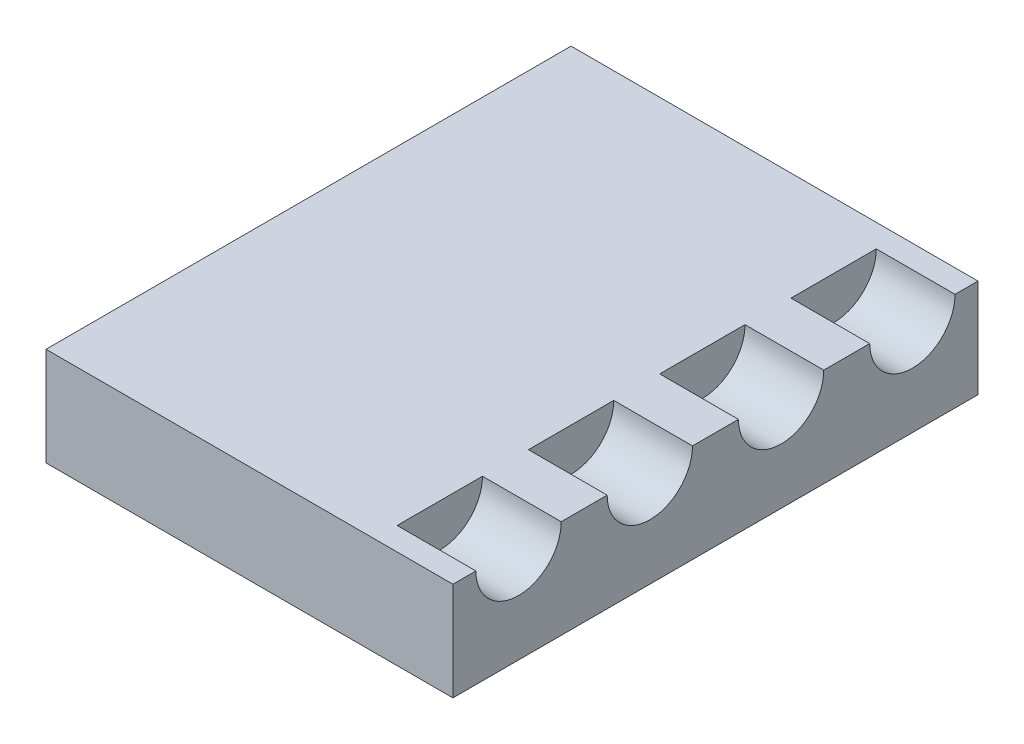
ISO-10303-21;
HEADER;
FILE_DESCRIPTION(('STEP AP214'),'2;1');
FILE_NAME('part.step','',(''),(''),'','','');
FILE_SCHEMA(('AUTOMOTIVE_DESIGN { 1 0 10303 214 1 1 1 1 }'));
ENDSEC;
DATA;
#1=APPLICATION_CONTEXT('core data for automotive mechanical design processes');
#2=APPLICATION_PROTOCOL_DEFINITION('international standard','automotive_design',2000,#1);
#3=PRODUCT_CONTEXT('',#1,'mechanical');
#4=PRODUCT('Part','Part','',(#3));
#5=PRODUCT_RELATED_PRODUCT_CATEGORY('part','',(#4));
#6=PRODUCT_DEFINITION_FORMATION('','',#4);
#7=PRODUCT_DEFINITION_CONTEXT('part definition',#1,'design');
#8=PRODUCT_DEFINITION('design','',#6,#7);
#9=PRODUCT_DEFINITION_SHAPE('','',#8);
#10=(LENGTH_UNIT() NAMED_UNIT(*) SI_UNIT(.MILLI.,.METRE.));
#11=(NAMED_UNIT(*) PLANE_ANGLE_UNIT() SI_UNIT($,.RADIAN.));
#12=(NAMED_UNIT(*) SI_UNIT($,.STERADIAN.) SOLID_ANGLE_UNIT());
#13=UNCERTAINTY_MEASURE_WITH_UNIT(LENGTH_MEASURE(1.E-05),#10,'distance_accuracy_value','');
#14=(GEOMETRIC_REPRESENTATION_CONTEXT(3) GLOBAL_UNCERTAINTY_ASSIGNED_CONTEXT((#13)) GLOBAL_UNIT_ASSIGNED_CONTEXT((#10,
#11,#12)) REPRESENTATION_CONTEXT('',''));
#15=CARTESIAN_POINT('',(0.,0.,0.));
#16=DIRECTION('',(0.,0.,1.));
#17=DIRECTION('',(1.,0.,0.));
#18=AXIS2_PLACEMENT_3D('',#15,#16,#17);
#19=CARTESIAN_POINT('',(12.,0.,-30.));
#20=DIRECTION('',(-1.,0.,0.));
#21=DIRECTION('',(0.,0.,1.));
#22=AXIS2_PLACEMENT_3D('',#19,#20,#21);
#23=CYLINDRICAL_SURFACE('',#22,6.5);
#24=CARTESIAN_POINT('',(0.,0.,-30.));
#25=DIRECTION('',(1.,0.,0.));
#26=DIRECTION('',(0.,0.,-1.));
#27=AXIS2_PLACEMENT_3D('',#24,#25,#26);
#28=CIRCLE('',#27,6.5);
#29=CARTESIAN_POINT('',(0.,0.,-23.5));
#30=VERTEX_POINT('',#29);
#31=CARTESIAN_POINT('',(0.,0.,-36.5));
#32=VERTEX_POINT('',#31);
#33=EDGE_CURVE('E148',#30,#32,#28,.T.);
#34=ORIENTED_EDGE('',*,*,#33,.F.);
#35=DIRECTION('',(-1.,0.,0.));
#36=VECTOR('',#35,1.);
#37=CARTESIAN_POINT('',(12.,0.,-23.5));
#38=LINE('',#37,#36);
#39=CARTESIAN_POINT('',(12.,0.,-23.5));
#40=VERTEX_POINT('',#39);
#41=EDGE_CURVE('E11',#40,#30,#38,.T.);
#42=ORIENTED_EDGE('',*,*,#41,.F.);
#43=CARTESIAN_POINT('',(12.,0.,-30.));
#44=DIRECTION('',(1.,0.,0.));
#45=DIRECTION('',(0.,0.,-1.));
#46=AXIS2_PLACEMENT_3D('',#43,#44,#45);
#47=CIRCLE('',#46,6.5);
#48=CARTESIAN_POINT('',(12.,0.,-36.5));
#49=VERTEX_POINT('',#48);
#50=EDGE_CURVE('E160',#40,#49,#47,.T.);
#51=ORIENTED_EDGE('',*,*,#50,.T.);
#52=DIRECTION('',(-1.,0.,0.));
#53=VECTOR('',#52,1.);
#54=CARTESIAN_POINT('',(12.,0.,-36.5));
#55=LINE('',#54,#53);
#56=EDGE_CURVE('E49',#49,#32,#55,.T.);
#57=ORIENTED_EDGE('',*,*,#56,.T.);
#58=EDGE_LOOP('',(#34,#42,#51,#57));
#59=FACE_BOUND('',#58,.T.);
#60=ADVANCED_FACE('F33',(#59),#23,.F.);
#61=CARTESIAN_POINT('',(12.,0.,-10.));
#62=DIRECTION('',(-1.,0.,0.));
#63=DIRECTION('',(0.,0.,1.));
#64=AXIS2_PLACEMENT_3D('',#61,#62,#63);
#65=CYLINDRICAL_SURFACE('',#64,6.50000000000001);
#66=CARTESIAN_POINT('',(0.,0.,-10.));
#67=DIRECTION('',(1.,0.,0.));
#68=DIRECTION('',(0.,0.,-1.));
#69=AXIS2_PLACEMENT_3D('',#66,#67,#68);
#70=CIRCLE('',#69,6.50000000000001);
#71=CARTESIAN_POINT('',(0.,0.,-3.49999999999999));
#72=VERTEX_POINT('',#71);
#73=CARTESIAN_POINT('',(0.,0.,-16.5));
#74=VERTEX_POINT('',#73);
#75=EDGE_CURVE('E150',#72,#74,#70,.T.);
#76=ORIENTED_EDGE('',*,*,#75,.F.);
#77=DIRECTION('',(-1.,0.,0.));
#78=VECTOR('',#77,1.);
#79=CARTESIAN_POINT('',(12.,0.,-3.49999999999999));
#80=LINE('',#79,#78);
#81=CARTESIAN_POINT('',(12.,0.,-3.49999999999999));
#82=VERTEX_POINT('',#81);
#83=EDGE_CURVE('E174',#82,#72,#80,.T.);
#84=ORIENTED_EDGE('',*,*,#83,.F.);
#85=CARTESIAN_POINT('',(12.,0.,-10.));
#86=DIRECTION('',(1.,0.,0.));
#87=DIRECTION('',(0.,0.,-1.));
#88=AXIS2_PLACEMENT_3D('',#85,#86,#87);
#89=CIRCLE('',#88,6.50000000000001);
#90=CARTESIAN_POINT('',(12.,0.,-16.5));
#91=VERTEX_POINT('',#90);
#92=EDGE_CURVE('E182',#82,#91,#89,.T.);
#93=ORIENTED_EDGE('',*,*,#92,.T.);
#94=DIRECTION('',(-1.,0.,0.));
#95=VECTOR('',#94,1.);
#96=CARTESIAN_POINT('',(12.,0.,-16.5));
#97=LINE('',#96,#95);
#98=EDGE_CURVE('E41',#91,#74,#97,.T.);
#99=ORIENTED_EDGE('',*,*,#98,.T.);
#100=EDGE_LOOP('',(#76,#84,#93,#99));
#101=FACE_BOUND('',#100,.T.);
#102=ADVANCED_FACE('F179',(#101),#65,.F.);
#103=CARTESIAN_POINT('',(12.,0.,10.));
#104=DIRECTION('',(-1.,0.,0.));
#105=DIRECTION('',(0.,0.,1.));
#106=AXIS2_PLACEMENT_3D('',#103,#104,#105);
#107=CYLINDRICAL_SURFACE('',#106,6.5);
#108=CARTESIAN_POINT('',(0.,0.,10.));
#109=DIRECTION('',(1.,0.,0.));
#110=DIRECTION('',(0.,0.,-1.));
#111=AXIS2_PLACEMENT_3D('',#108,#109,#110);
#112=CIRCLE('',#111,6.5);
#113=CARTESIAN_POINT('',(0.,0.,16.5));
#114=VERTEX_POINT('',#113);
#115=CARTESIAN_POINT('',(0.,0.,3.5));
#116=VERTEX_POINT('',#115);
#117=EDGE_CURVE('E154',#114,#116,#112,.T.);
#118=ORIENTED_EDGE('',*,*,#117,.F.);
#119=DIRECTION('',(-1.,0.,0.));
#120=VECTOR('',#119,1.);
#121=CARTESIAN_POINT('',(12.,0.,16.5));
#122=LINE('',#121,#120);
#123=CARTESIAN_POINT('',(12.,0.,16.5));
#124=VERTEX_POINT('',#123);
#125=EDGE_CURVE('E170',#124,#114,#122,.T.);
#126=ORIENTED_EDGE('',*,*,#125,.F.);
#127=CARTESIAN_POINT('',(12.,0.,10.));
#128=DIRECTION('',(1.,0.,0.));
#129=DIRECTION('',(0.,0.,-1.));
#130=AXIS2_PLACEMENT_3D('',#127,#128,#129);
#131=CIRCLE('',#130,6.5);
#132=CARTESIAN_POINT('',(12.,0.,3.5));
#133=VERTEX_POINT('',#132);
#134=EDGE_CURVE('E203',#124,#133,#131,.T.);
#135=ORIENTED_EDGE('',*,*,#134,.T.);
#136=DIRECTION('',(-1.,0.,0.));
#137=VECTOR('',#136,1.);
#138=CARTESIAN_POINT('',(12.,0.,3.5));
#139=LINE('',#138,#137);
#140=EDGE_CURVE('E172',#133,#116,#139,.T.);
#141=ORIENTED_EDGE('',*,*,#140,.T.);
#142=EDGE_LOOP('',(#118,#126,#135,#141));
#143=FACE_BOUND('',#142,.T.);
#144=ADVANCED_FACE('F215',(#143),#107,.F.);
#145=CARTESIAN_POINT('',(12.,0.,30.));
#146=DIRECTION('',(-1.,0.,0.));
#147=DIRECTION('',(0.,0.,1.));
#148=AXIS2_PLACEMENT_3D('',#145,#146,#147);
#149=CYLINDRICAL_SURFACE('',#148,6.5);
#150=CARTESIAN_POINT('',(0.,0.,30.));
#151=DIRECTION('',(1.,0.,0.));
#152=DIRECTION('',(0.,0.,-1.));
#153=AXIS2_PLACEMENT_3D('',#150,#151,#152);
#154=CIRCLE('',#153,6.5);
#155=CARTESIAN_POINT('',(0.,0.,36.5));
#156=VERTEX_POINT('',#155);
#157=CARTESIAN_POINT('',(0.,0.,23.5));
#158=VERTEX_POINT('',#157);
#159=EDGE_CURVE('E157',#156,#158,#154,.T.);
#160=ORIENTED_EDGE('',*,*,#159,.F.);
#161=DIRECTION('',(-1.,0.,0.));
#162=VECTOR('',#161,1.);
#163=CARTESIAN_POINT('',(12.,0.,36.5));
#164=LINE('',#163,#162);
#165=CARTESIAN_POINT('',(12.,0.,36.5));
#166=VERTEX_POINT('',#165);
#167=EDGE_CURVE('E75',#166,#156,#164,.T.);
#168=ORIENTED_EDGE('',*,*,#167,.F.);
#169=CARTESIAN_POINT('',(12.,0.,30.));
#170=DIRECTION('',(1.,0.,0.));
#171=DIRECTION('',(0.,0.,-1.));
#172=AXIS2_PLACEMENT_3D('',#169,#170,#171);
#173=CIRCLE('',#172,6.5);
#174=CARTESIAN_POINT('',(12.,0.,23.5));
#175=VERTEX_POINT('',#174);
#176=EDGE_CURVE('E207',#166,#175,#173,.T.);
#177=ORIENTED_EDGE('',*,*,#176,.T.);
#178=DIRECTION('',(-1.,0.,0.));
#179=VECTOR('',#178,1.);
#180=CARTESIAN_POINT('',(12.,0.,23.5));
#181=LINE('',#180,#179);
#182=EDGE_CURVE('E168',#175,#158,#181,.T.);
#183=ORIENTED_EDGE('',*,*,#182,.T.);
#184=EDGE_LOOP('',(#160,#168,#177,#183));
#185=FACE_BOUND('',#184,.T.);
#186=ADVANCED_FACE('F249',(#185),#149,.F.);
#187=CARTESIAN_POINT('',(12.,0.,40.));
#188=DIRECTION('',(0.,0.,-1.));
#189=DIRECTION('',(-1.,0.,0.));
#190=AXIS2_PLACEMENT_3D('',#187,#188,#189);
#191=PLANE('',#190);
#192=DIRECTION('',(-1.,0.,0.));
#193=VECTOR('',#192,1.);
#194=CARTESIAN_POINT('',(12.,0.,40.));
#195=LINE('',#194,#193);
#196=CARTESIAN_POINT('',(12.,0.,40.));
#197=VERTEX_POINT('',#196);
#198=CARTESIAN_POINT('',(-50.,0.,40.));
#199=VERTEX_POINT('',#198);
#200=EDGE_CURVE('E164',#197,#199,#195,.T.);
#201=ORIENTED_EDGE('',*,*,#200,.T.);
#202=DIRECTION('',(0.,1.,0.));
#203=VECTOR('',#202,1.);
#204=CARTESIAN_POINT('',(-50.,-15.,40.));
#205=LINE('',#204,#203);
#206=CARTESIAN_POINT('',(-50.,-15.,40.));
#207=VERTEX_POINT('',#206);
#208=EDGE_CURVE('E244',#207,#199,#205,.T.);
#209=ORIENTED_EDGE('',*,*,#208,.F.);
#210=DIRECTION('',(-1.,0.,0.));
#211=VECTOR('',#210,1.);
#212=CARTESIAN_POINT('',(12.,-15.,40.));
#213=LINE('',#212,#211);
#214=CARTESIAN_POINT('',(12.,-15.,40.));
#215=VERTEX_POINT('',#214);
#216=EDGE_CURVE('E136',#215,#207,#213,.T.);
#217=ORIENTED_EDGE('',*,*,#216,.F.);
#218=DIRECTION('',(0.,-1.,0.));
#219=VECTOR('',#218,1.);
#220=CARTESIAN_POINT('',(12.,0.,40.));
#221=LINE('',#220,#219);
#222=EDGE_CURVE('E121',#197,#215,#221,.T.);
#223=ORIENTED_EDGE('',*,*,#222,.F.);
#224=EDGE_LOOP('',(#201,#209,#217,#223));
#225=FACE_BOUND('',#224,.T.);
#226=ADVANCED_FACE('F252',(#225),#191,.F.);
#227=CARTESIAN_POINT('',(12.,-15.,0.));
#228=DIRECTION('',(0.,1.,0.));
#229=DIRECTION('',(0.,0.,1.));
#230=AXIS2_PLACEMENT_3D('',#227,#228,#229);
#231=PLANE('',#230);
#232=ORIENTED_EDGE('',*,*,#216,.T.);
#233=DIRECTION('',(0.,0.,1.));
#234=VECTOR('',#233,1.);
#235=CARTESIAN_POINT('',(-50.,-15.,-40.));
#236=LINE('',#235,#234);
#237=CARTESIAN_POINT('',(-50.,-15.,-40.));
#238=VERTEX_POINT('',#237);
#239=EDGE_CURVE('E132',#238,#207,#236,.T.);
#240=ORIENTED_EDGE('',*,*,#239,.F.);
#241=DIRECTION('',(-1.,0.,0.));
#242=VECTOR('',#241,1.);
#243=CARTESIAN_POINT('',(12.,-15.,-40.));
#244=LINE('',#243,#242);
#245=CARTESIAN_POINT('',(12.,-15.,-40.));
#246=VERTEX_POINT('',#245);
#247=EDGE_CURVE('E128',#246,#238,#244,.T.);
#248=ORIENTED_EDGE('',*,*,#247,.F.);
#249=DIRECTION('',(0.,0.,-1.));
#250=VECTOR('',#249,1.);
#251=CARTESIAN_POINT('',(12.,-15.,0.));
#252=LINE('',#251,#250);
#253=EDGE_CURVE('E113',#215,#246,#252,.T.);
#254=ORIENTED_EDGE('',*,*,#253,.F.);
#255=EDGE_LOOP('',(#232,#240,#248,#254));
#256=FACE_BOUND('',#255,.T.);
#257=ADVANCED_FACE('F129',(#256),#231,.F.);
#258=CARTESIAN_POINT('',(12.,0.,-40.));
#259=DIRECTION('',(0.,0.,-1.));
#260=DIRECTION('',(-1.,0.,0.));
#261=AXIS2_PLACEMENT_3D('',#258,#259,#260);
#262=PLANE('',#261);
#263=ORIENTED_EDGE('',*,*,#247,.T.);
#264=DIRECTION('',(0.,-1.,0.));
#265=VECTOR('',#264,1.);
#266=CARTESIAN_POINT('',(-50.,-15.,-40.));
#267=LINE('',#266,#265);
#268=CARTESIAN_POINT('',(-50.,0.,-40.));
#269=VERTEX_POINT('',#268);
#270=EDGE_CURVE('E242',#269,#238,#267,.T.);
#271=ORIENTED_EDGE('',*,*,#270,.F.);
#272=DIRECTION('',(-1.,0.,0.));
#273=VECTOR('',#272,1.);
#274=CARTESIAN_POINT('',(12.,0.,-40.));
#275=LINE('',#274,#273);
#276=CARTESIAN_POINT('',(12.,0.,-40.));
#277=VERTEX_POINT('',#276);
#278=EDGE_CURVE('E137',#277,#269,#275,.T.);
#279=ORIENTED_EDGE('',*,*,#278,.F.);
#280=DIRECTION('',(0.,-1.,0.));
#281=VECTOR('',#280,1.);
#282=CARTESIAN_POINT('',(12.,0.,-40.));
#283=LINE('',#282,#281);
#284=EDGE_CURVE('E118',#277,#246,#283,.T.);
#285=ORIENTED_EDGE('',*,*,#284,.T.);
#286=EDGE_LOOP('',(#263,#271,#279,#285));
#287=FACE_BOUND('',#286,.T.);
#288=ADVANCED_FACE('F139',(#287),#262,.T.);
#289=CARTESIAN_POINT('',(12.,0.,0.));
#290=DIRECTION('',(0.,1.,0.));
#291=DIRECTION('',(0.,0.,1.));
#292=AXIS2_PLACEMENT_3D('',#289,#290,#291);
#293=PLANE('',#292);
#294=ORIENTED_EDGE('',*,*,#278,.T.);
#295=DIRECTION('',(0.,0.,-1.));
#296=VECTOR('',#295,1.);
#297=CARTESIAN_POINT('',(-50.,0.,-40.));
#298=LINE('',#297,#296);
#299=EDGE_CURVE('E151',#199,#269,#298,.T.);
#300=ORIENTED_EDGE('',*,*,#299,.F.);
#301=ORIENTED_EDGE('',*,*,#200,.F.);
#302=DIRECTION('',(0.,0.,-1.));
#303=VECTOR('',#302,1.);
#304=CARTESIAN_POINT('',(12.,0.,0.));
#305=LINE('',#304,#303);
#306=EDGE_CURVE('E144',#197,#166,#305,.T.);
#307=ORIENTED_EDGE('',*,*,#306,.T.);
#308=ORIENTED_EDGE('',*,*,#167,.T.);
#309=DIRECTION('',(0.,0.,-1.));
#310=VECTOR('',#309,1.);
#311=CARTESIAN_POINT('',(0.,0.,-40.));
#312=LINE('',#311,#310);
#313=EDGE_CURVE('E196',#156,#158,#312,.T.);
#314=ORIENTED_EDGE('',*,*,#313,.T.);
#315=ORIENTED_EDGE('',*,*,#182,.F.);
#316=EDGE_CURVE('E206',#175,#124,#305,.T.);
#317=ORIENTED_EDGE('',*,*,#316,.T.);
#318=ORIENTED_EDGE('',*,*,#125,.T.);
#319=EDGE_CURVE('E192',#114,#116,#312,.T.);
#320=ORIENTED_EDGE('',*,*,#319,.T.);
#321=ORIENTED_EDGE('',*,*,#140,.F.);
#322=EDGE_CURVE('E201',#133,#82,#305,.T.);
#323=ORIENTED_EDGE('',*,*,#322,.T.);
#324=ORIENTED_EDGE('',*,*,#83,.T.);
#325=EDGE_CURVE('E189',#72,#74,#312,.T.);
#326=ORIENTED_EDGE('',*,*,#325,.T.);
#327=ORIENTED_EDGE('',*,*,#98,.F.);
#328=EDGE_CURVE('E145',#91,#40,#305,.T.);
#329=ORIENTED_EDGE('',*,*,#328,.T.);
#330=ORIENTED_EDGE('',*,*,#41,.T.);
#331=EDGE_CURVE('E193',#30,#32,#312,.T.);
#332=ORIENTED_EDGE('',*,*,#331,.T.);
#333=ORIENTED_EDGE('',*,*,#56,.F.);
#334=EDGE_CURVE('E141',#49,#277,#305,.T.);
#335=ORIENTED_EDGE('',*,*,#334,.T.);
#336=EDGE_LOOP('',(#294,#300,#301,#307,#308,#314,#315,#317,#318,#320,#321,#323,#324,#326,#327,
#329,#330,#332,#333,#335));
#337=FACE_BOUND('',#336,.T.);
#338=ADVANCED_FACE('F190',(#337),#293,.T.);
#339=CARTESIAN_POINT('',(12.,0.,0.));
#340=DIRECTION('',(1.,0.,0.));
#341=DIRECTION('',(0.,0.,-1.));
#342=AXIS2_PLACEMENT_3D('',#339,#340,#341);
#343=PLANE('',#342);
#344=ORIENTED_EDGE('',*,*,#50,.F.);
#345=ORIENTED_EDGE('',*,*,#328,.F.);
#346=ORIENTED_EDGE('',*,*,#92,.F.);
#347=ORIENTED_EDGE('',*,*,#322,.F.);
#348=ORIENTED_EDGE('',*,*,#134,.F.);
#349=ORIENTED_EDGE('',*,*,#316,.F.);
#350=ORIENTED_EDGE('',*,*,#176,.F.);
#351=ORIENTED_EDGE('',*,*,#306,.F.);
#352=ORIENTED_EDGE('',*,*,#222,.T.);
#353=ORIENTED_EDGE('',*,*,#253,.T.);
#354=ORIENTED_EDGE('',*,*,#284,.F.);
#355=ORIENTED_EDGE('',*,*,#334,.F.);
#356=EDGE_LOOP('',(#344,#345,#346,#347,#348,#349,#350,#351,#352,#353,#354,#355));
#357=FACE_BOUND('',#356,.T.);
#358=ADVANCED_FACE('F115',(#357),#343,.T.);
#359=CARTESIAN_POINT('',(0.,0.,0.));
#360=DIRECTION('',(1.,0.,0.));
#361=DIRECTION('',(0.,0.,-1.));
#362=AXIS2_PLACEMENT_3D('',#359,#360,#361);
#363=PLANE('',#362);
#364=ORIENTED_EDGE('',*,*,#331,.F.);
#365=ORIENTED_EDGE('',*,*,#33,.T.);
#366=EDGE_LOOP('',(#364,#365));
#367=FACE_BOUND('',#366,.T.);
#368=ADVANCED_FACE('F227',(#367),#363,.T.);
#369=ORIENTED_EDGE('',*,*,#313,.F.);
#370=ORIENTED_EDGE('',*,*,#159,.T.);
#371=EDGE_LOOP('',(#369,#370));
#372=FACE_BOUND('',#371,.T.);
#373=ADVANCED_FACE('F220',(#372),#363,.T.);
#374=ORIENTED_EDGE('',*,*,#319,.F.);
#375=ORIENTED_EDGE('',*,*,#117,.T.);
#376=EDGE_LOOP('',(#374,#375));
#377=FACE_BOUND('',#376,.T.);
#378=ADVANCED_FACE('F218',(#377),#363,.T.);
#379=ORIENTED_EDGE('',*,*,#325,.F.);
#380=ORIENTED_EDGE('',*,*,#75,.T.);
#381=EDGE_LOOP('',(#379,#380));
#382=FACE_BOUND('',#381,.T.);
#383=ADVANCED_FACE('F188',(#382),#363,.T.);
#384=CARTESIAN_POINT('',(-50.,0.,0.));
#385=DIRECTION('',(1.,0.,0.));
#386=DIRECTION('',(0.,0.,-1.));
#387=AXIS2_PLACEMENT_3D('',#384,#385,#386);
#388=PLANE('',#387);
#389=ORIENTED_EDGE('',*,*,#270,.T.);
#390=ORIENTED_EDGE('',*,*,#239,.T.);
#391=ORIENTED_EDGE('',*,*,#208,.T.);
#392=ORIENTED_EDGE('',*,*,#299,.T.);
#393=EDGE_LOOP('',(#389,#390,#391,#392));
#394=FACE_BOUND('',#393,.T.);
#395=ADVANCED_FACE('F226',(#394),#388,.F.);
#396=CLOSED_SHELL('',(#60,#102,#144,#186,#226,#257,#288,#338,#358,#368,#373,#378,#383,#395));
#397=MANIFOLD_SOLID_BREP('B2',#396);
#398=ADVANCED_BREP_SHAPE_REPRESENTATION('',(#18,#397),#14);
#399=SHAPE_DEFINITION_REPRESENTATION(#9,#398);
ENDSEC;
END-ISO-10303-21;
